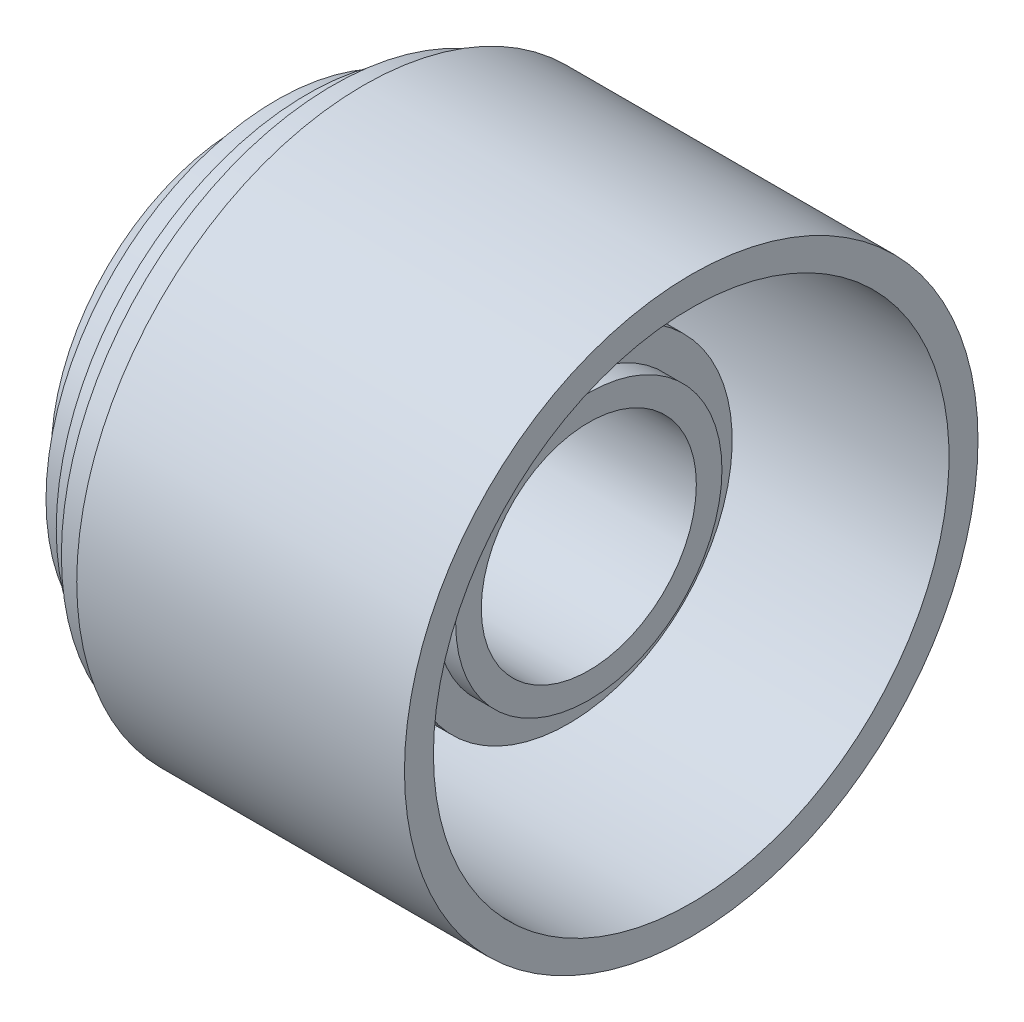
ISO-10303-21;
HEADER;
FILE_DESCRIPTION(('STEP AP214'),'2;1');
FILE_NAME('part.step','',(''),(''),'','','');
FILE_SCHEMA(('AUTOMOTIVE_DESIGN { 1 0 10303 214 1 1 1 1 }'));
ENDSEC;
DATA;
#1=APPLICATION_CONTEXT('core data for automotive mechanical design processes');
#2=APPLICATION_PROTOCOL_DEFINITION('international standard','automotive_design',2000,#1);
#3=PRODUCT_CONTEXT('',#1,'mechanical');
#4=PRODUCT('Part','Part','',(#3));
#5=PRODUCT_RELATED_PRODUCT_CATEGORY('part','',(#4));
#6=PRODUCT_DEFINITION_FORMATION('','',#4);
#7=PRODUCT_DEFINITION_CONTEXT('part definition',#1,'design');
#8=PRODUCT_DEFINITION('design','',#6,#7);
#9=PRODUCT_DEFINITION_SHAPE('','',#8);
#10=(LENGTH_UNIT() NAMED_UNIT(*) SI_UNIT(.MILLI.,.METRE.));
#11=(NAMED_UNIT(*) PLANE_ANGLE_UNIT() SI_UNIT($,.RADIAN.));
#12=(NAMED_UNIT(*) SI_UNIT($,.STERADIAN.) SOLID_ANGLE_UNIT());
#13=UNCERTAINTY_MEASURE_WITH_UNIT(LENGTH_MEASURE(1.E-05),#10,'distance_accuracy_value','');
#14=(GEOMETRIC_REPRESENTATION_CONTEXT(3) GLOBAL_UNCERTAINTY_ASSIGNED_CONTEXT((#13)) GLOBAL_UNIT_ASSIGNED_CONTEXT((#10,
#11,#12)) REPRESENTATION_CONTEXT('',''));
#15=CARTESIAN_POINT('',(0.,0.,0.));
#16=DIRECTION('',(0.,0.,1.));
#17=DIRECTION('',(1.,0.,0.));
#18=AXIS2_PLACEMENT_3D('',#15,#16,#17);
#19=CARTESIAN_POINT('',(-90.5,0.,0.));
#20=DIRECTION('',(-1.,0.,0.));
#21=DIRECTION('',(0.,0.,1.));
#22=AXIS2_PLACEMENT_3D('',#19,#20,#21);
#23=CYLINDRICAL_SURFACE('',#22,13.);
#24=CARTESIAN_POINT('',(0.,0.,0.));
#25=DIRECTION('',(-1.,0.,0.));
#26=DIRECTION('',(0.,0.,1.));
#27=AXIS2_PLACEMENT_3D('',#24,#25,#26);
#28=CIRCLE('',#27,13.);
#29=CARTESIAN_POINT('',(0.,0.,13.));
#30=VERTEX_POINT('',#29);
#31=EDGE_CURVE('E355',#30,#30,#28,.T.);
#32=ORIENTED_EDGE('',*,*,#31,.T.);
#33=EDGE_LOOP('',(#32));
#34=FACE_BOUND('',#33,.T.);
#35=CARTESIAN_POINT('',(-2.,0.,0.));
#36=DIRECTION('',(-1.,0.,0.));
#37=DIRECTION('',(0.,0.,1.));
#38=AXIS2_PLACEMENT_3D('',#35,#36,#37);
#39=CIRCLE('',#38,13.);
#40=CARTESIAN_POINT('',(-2.,0.,13.));
#41=VERTEX_POINT('',#40);
#42=EDGE_CURVE('E10',#41,#41,#39,.T.);
#43=ORIENTED_EDGE('',*,*,#42,.F.);
#44=EDGE_LOOP('',(#43));
#45=FACE_BOUND('',#44,.T.);
#46=ADVANCED_FACE('F348',(#34,#45),#23,.T.);
#47=CARTESIAN_POINT('',(0.,13.,0.));
#48=DIRECTION('',(-1.,0.,0.));
#49=DIRECTION('',(0.,0.,1.));
#50=AXIS2_PLACEMENT_3D('',#47,#48,#49);
#51=PLANE('',#50);
#52=ORIENTED_EDGE('',*,*,#31,.F.);
#53=EDGE_LOOP('',(#52));
#54=FACE_BOUND('',#53,.T.);
#55=CARTESIAN_POINT('',(0.,0.,0.));
#56=DIRECTION('',(-1.,0.,0.));
#57=DIRECTION('',(0.,0.,1.));
#58=AXIS2_PLACEMENT_3D('',#55,#56,#57);
#59=CIRCLE('',#58,10.5);
#60=CARTESIAN_POINT('',(0.,0.,10.5));
#61=VERTEX_POINT('',#60);
#62=EDGE_CURVE('E363',#61,#61,#59,.T.);
#63=ORIENTED_EDGE('',*,*,#62,.T.);
#64=EDGE_LOOP('',(#63));
#65=FACE_BOUND('',#64,.T.);
#66=ADVANCED_FACE('F350',(#54,#65),#51,.F.);
#67=CARTESIAN_POINT('',(-21.,0.,0.));
#68=DIRECTION('',(-1.,0.,0.));
#69=DIRECTION('',(0.,0.,1.));
#70=AXIS2_PLACEMENT_3D('',#67,#68,#69);
#71=CONICAL_SURFACE('',#70,13.,0.694738276196703);
#72=CARTESIAN_POINT('',(-18.,0.,0.));
#73=DIRECTION('',(-1.,0.,0.));
#74=DIRECTION('',(0.,0.,1.));
#75=AXIS2_PLACEMENT_3D('',#72,#73,#74);
#76=CIRCLE('',#75,10.5);
#77=CARTESIAN_POINT('',(-18.,0.,10.5));
#78=VERTEX_POINT('',#77);
#79=EDGE_CURVE('E359',#78,#78,#76,.T.);
#80=ORIENTED_EDGE('',*,*,#79,.F.);
#81=EDGE_LOOP('',(#80));
#82=FACE_BOUND('',#81,.T.);
#83=CARTESIAN_POINT('',(-21.,0.,0.));
#84=DIRECTION('',(-1.,0.,0.));
#85=DIRECTION('',(0.,0.,1.));
#86=AXIS2_PLACEMENT_3D('',#83,#84,#85);
#87=CIRCLE('',#86,13.);
#88=CARTESIAN_POINT('',(-21.,0.,13.));
#89=VERTEX_POINT('',#88);
#90=EDGE_CURVE('E368',#89,#89,#87,.F.);
#91=ORIENTED_EDGE('',*,*,#90,.F.);
#92=EDGE_LOOP('',(#91));
#93=FACE_BOUND('',#92,.T.);
#94=ADVANCED_FACE('F572',(#82,#93),#71,.F.);
#95=CARTESIAN_POINT('',(-90.5,0.,0.));
#96=DIRECTION('',(-1.,0.,0.));
#97=DIRECTION('',(0.,0.,1.));
#98=AXIS2_PLACEMENT_3D('',#95,#96,#97);
#99=CYLINDRICAL_SURFACE('',#98,10.5);
#100=ORIENTED_EDGE('',*,*,#62,.F.);
#101=EDGE_LOOP('',(#100));
#102=FACE_BOUND('',#101,.T.);
#103=ORIENTED_EDGE('',*,*,#79,.T.);
#104=EDGE_LOOP('',(#103));
#105=FACE_BOUND('',#104,.T.);
#106=ADVANCED_FACE('F565',(#102,#105),#99,.F.);
#107=CARTESIAN_POINT('',(-35.5,0.,0.));
#108=DIRECTION('',(-1.,0.,0.));
#109=DIRECTION('',(0.,0.,1.));
#110=AXIS2_PLACEMENT_3D('',#107,#108,#109);
#111=CYLINDRICAL_SURFACE('',#110,13.);
#112=CARTESIAN_POINT('',(-27.,0.,0.));
#113=DIRECTION('',(-1.,0.,0.));
#114=DIRECTION('',(0.,0.,1.));
#115=AXIS2_PLACEMENT_3D('',#112,#113,#114);
#116=CIRCLE('',#115,13.);
#117=CARTESIAN_POINT('',(-27.,0.,13.));
#118=VERTEX_POINT('',#117);
#119=EDGE_CURVE('E432',#118,#118,#116,.T.);
#120=ORIENTED_EDGE('',*,*,#119,.T.);
#121=EDGE_LOOP('',(#120));
#122=FACE_BOUND('',#121,.T.);
#123=ORIENTED_EDGE('',*,*,#90,.T.);
#124=EDGE_LOOP('',(#123));
#125=FACE_BOUND('',#124,.T.);
#126=ADVANCED_FACE('F436',(#122,#125),#111,.F.);
#127=CARTESIAN_POINT('',(-2.,13.,0.));
#128=DIRECTION('',(-1.,0.,0.));
#129=DIRECTION('',(0.,0.,1.));
#130=AXIS2_PLACEMENT_3D('',#127,#128,#129);
#131=PLANE('',#130);
#132=CARTESIAN_POINT('',(-2.,0.,0.));
#133=DIRECTION('',(-1.,0.,0.));
#134=DIRECTION('',(0.,0.,1.));
#135=AXIS2_PLACEMENT_3D('',#132,#133,#134);
#136=CIRCLE('',#135,16.);
#137=CARTESIAN_POINT('',(-2.,0.,16.));
#138=VERTEX_POINT('',#137);
#139=EDGE_CURVE('E371',#138,#138,#136,.T.);
#140=ORIENTED_EDGE('',*,*,#139,.F.);
#141=EDGE_LOOP('',(#140));
#142=FACE_BOUND('',#141,.T.);
#143=ORIENTED_EDGE('',*,*,#42,.T.);
#144=EDGE_LOOP('',(#143));
#145=FACE_BOUND('',#144,.T.);
#146=ADVANCED_FACE('F556',(#142,#145),#131,.F.);
#147=CARTESIAN_POINT('',(-35.5,0.,0.));
#148=DIRECTION('',(-1.,0.,0.));
#149=DIRECTION('',(0.,0.,1.));
#150=AXIS2_PLACEMENT_3D('',#147,#148,#149);
#151=CYLINDRICAL_SURFACE('',#150,16.);
#152=CARTESIAN_POINT('',(-22.,0.,0.));
#153=DIRECTION('',(-1.,0.,0.));
#154=DIRECTION('',(0.,0.,1.));
#155=AXIS2_PLACEMENT_3D('',#152,#153,#154);
#156=CIRCLE('',#155,16.);
#157=CARTESIAN_POINT('',(-22.,0.,16.));
#158=VERTEX_POINT('',#157);
#159=EDGE_CURVE('E374',#158,#158,#156,.T.);
#160=ORIENTED_EDGE('',*,*,#159,.F.);
#161=EDGE_LOOP('',(#160));
#162=FACE_BOUND('',#161,.T.);
#163=ORIENTED_EDGE('',*,*,#139,.T.);
#164=EDGE_LOOP('',(#163));
#165=FACE_BOUND('',#164,.T.);
#166=ADVANCED_FACE('F550',(#162,#165),#151,.T.);
#167=CARTESIAN_POINT('',(-22.,0.,0.));
#168=DIRECTION('',(-1.,0.,0.));
#169=DIRECTION('',(0.,0.,1.));
#170=AXIS2_PLACEMENT_3D('',#167,#168,#169);
#171=TOROIDAL_SURFACE('',#170,19.1875,3.1875);
#172=CARTESIAN_POINT('',(-23.7681068754679,0.,0.));
#173=DIRECTION('',(-1.,0.,0.));
#174=DIRECTION('',(0.,0.,1.));
#175=AXIS2_PLACEMENT_3D('',#172,#173,#174);
#176=CIRCLE('',#175,21.8396603132019);
#177=CARTESIAN_POINT('',(-23.7681068754679,0.,21.8396603132019));
#178=VERTEX_POINT('',#177);
#179=EDGE_CURVE('E378',#178,#178,#176,.T.);
#180=ORIENTED_EDGE('',*,*,#179,.F.);
#181=EDGE_LOOP('',(#180));
#182=FACE_BOUND('',#181,.T.);
#183=ORIENTED_EDGE('',*,*,#159,.T.);
#184=EDGE_LOOP('',(#183));
#185=FACE_BOUND('',#184,.T.);
#186=ADVANCED_FACE('F544',(#182,#185),#171,.F.);
#187=CARTESIAN_POINT('',(-23.7681068754679,0.,0.));
#188=DIRECTION('',(1.,0.,0.));
#189=DIRECTION('',(0.,0.,-1.));
#190=AXIS2_PLACEMENT_3D('',#187,#188,#189);
#191=CONICAL_SURFACE('',#190,21.8396603132019,0.588002603547568);
#192=CARTESIAN_POINT('',(-20.0277370757849,0.,0.));
#193=DIRECTION('',(-1.,0.,0.));
#194=DIRECTION('',(0.,0.,1.));
#195=AXIS2_PLACEMENT_3D('',#192,#193,#194);
#196=CIRCLE('',#195,24.3332401796572);
#197=CARTESIAN_POINT('',(-20.0277370757849,0.,24.3332401796572));
#198=VERTEX_POINT('',#197);
#199=EDGE_CURVE('E381',#198,#198,#196,.T.);
#200=ORIENTED_EDGE('',*,*,#199,.F.);
#201=EDGE_LOOP('',(#200));
#202=FACE_BOUND('',#201,.T.);
#203=ORIENTED_EDGE('',*,*,#179,.T.);
#204=EDGE_LOOP('',(#203));
#205=FACE_BOUND('',#204,.T.);
#206=ADVANCED_FACE('F538',(#202,#205),#191,.F.);
#207=CARTESIAN_POINT('',(-17.2542360946587,0.,0.));
#208=DIRECTION('',(-1.,0.,0.));
#209=DIRECTION('',(0.,0.,1.));
#210=AXIS2_PLACEMENT_3D('',#207,#208,#209);
#211=TOROIDAL_SURFACE('',#210,20.172988707968,5.);
#212=CARTESIAN_POINT('',(-17.2542360946587,0.,0.));
#213=DIRECTION('',(-1.,0.,0.));
#214=DIRECTION('',(0.,0.,1.));
#215=AXIS2_PLACEMENT_3D('',#212,#213,#214);
#216=CIRCLE('',#215,25.172988707968);
#217=CARTESIAN_POINT('',(-17.2542360946587,0.,25.172988707968));
#218=VERTEX_POINT('',#217);
#219=EDGE_CURVE('E384',#218,#218,#216,.T.);
#220=ORIENTED_EDGE('',*,*,#219,.F.);
#221=EDGE_LOOP('',(#220));
#222=FACE_BOUND('',#221,.T.);
#223=ORIENTED_EDGE('',*,*,#199,.T.);
#224=EDGE_LOOP('',(#223));
#225=FACE_BOUND('',#224,.T.);
#226=ADVANCED_FACE('F532',(#222,#225),#211,.F.);
#227=CARTESIAN_POINT('',(-35.5,0.,0.));
#228=DIRECTION('',(-1.,0.,0.));
#229=DIRECTION('',(0.,0.,1.));
#230=AXIS2_PLACEMENT_3D('',#227,#228,#229);
#231=CYLINDRICAL_SURFACE('',#230,25.172988707968);
#232=CARTESIAN_POINT('',(9.99999999999999,0.,0.));
#233=DIRECTION('',(-1.,0.,0.));
#234=DIRECTION('',(0.,0.,1.));
#235=AXIS2_PLACEMENT_3D('',#232,#233,#234);
#236=CIRCLE('',#235,25.172988707968);
#237=CARTESIAN_POINT('',(9.99999999999999,0.,25.172988707968));
#238=VERTEX_POINT('',#237);
#239=EDGE_CURVE('E387',#238,#238,#236,.T.);
#240=ORIENTED_EDGE('',*,*,#239,.F.);
#241=EDGE_LOOP('',(#240));
#242=FACE_BOUND('',#241,.T.);
#243=ORIENTED_EDGE('',*,*,#219,.T.);
#244=EDGE_LOOP('',(#243));
#245=FACE_BOUND('',#244,.T.);
#246=ADVANCED_FACE('F526',(#242,#245),#231,.F.);
#247=CARTESIAN_POINT('',(9.99999999999999,25.172988707968,0.));
#248=DIRECTION('',(-1.,0.,0.));
#249=DIRECTION('',(0.,0.,1.));
#250=AXIS2_PLACEMENT_3D('',#247,#248,#249);
#251=PLANE('',#250);
#252=CARTESIAN_POINT('',(9.99999999999999,0.,0.));
#253=DIRECTION('',(-1.,0.,0.));
#254=DIRECTION('',(0.,0.,1.));
#255=AXIS2_PLACEMENT_3D('',#252,#253,#254);
#256=CIRCLE('',#255,28.);
#257=CARTESIAN_POINT('',(9.99999999999999,0.,28.));
#258=VERTEX_POINT('',#257);
#259=EDGE_CURVE('E390',#258,#258,#256,.T.);
#260=ORIENTED_EDGE('',*,*,#259,.F.);
#261=EDGE_LOOP('',(#260));
#262=FACE_BOUND('',#261,.T.);
#263=ORIENTED_EDGE('',*,*,#239,.T.);
#264=EDGE_LOOP('',(#263));
#265=FACE_BOUND('',#264,.T.);
#266=ADVANCED_FACE('F520',(#262,#265),#251,.F.);
#267=CARTESIAN_POINT('',(-35.5,0.,0.));
#268=DIRECTION('',(-1.,0.,0.));
#269=DIRECTION('',(0.,0.,1.));
#270=AXIS2_PLACEMENT_3D('',#267,#268,#269);
#271=CYLINDRICAL_SURFACE('',#270,28.);
#272=CARTESIAN_POINT('',(-22.,0.,0.));
#273=DIRECTION('',(-1.,0.,0.));
#274=DIRECTION('',(0.,0.,1.));
#275=AXIS2_PLACEMENT_3D('',#272,#273,#274);
#276=CIRCLE('',#275,28.);
#277=CARTESIAN_POINT('',(-22.,0.,28.));
#278=VERTEX_POINT('',#277);
#279=EDGE_CURVE('E393',#278,#278,#276,.T.);
#280=ORIENTED_EDGE('',*,*,#279,.F.);
#281=EDGE_LOOP('',(#280));
#282=FACE_BOUND('',#281,.T.);
#283=ORIENTED_EDGE('',*,*,#259,.T.);
#284=EDGE_LOOP('',(#283));
#285=FACE_BOUND('',#284,.T.);
#286=ADVANCED_FACE('F514',(#282,#285),#271,.T.);
#287=CARTESIAN_POINT('',(-22.,28.,0.));
#288=DIRECTION('',(1.,0.,0.));
#289=DIRECTION('',(0.,0.,-1.));
#290=AXIS2_PLACEMENT_3D('',#287,#288,#289);
#291=PLANE('',#290);
#292=CARTESIAN_POINT('',(-22.,0.,0.));
#293=DIRECTION('',(-1.,0.,0.));
#294=DIRECTION('',(0.,0.,1.));
#295=AXIS2_PLACEMENT_3D('',#292,#293,#294);
#296=CIRCLE('',#295,26.5000000000001);
#297=CARTESIAN_POINT('',(-22.,0.,26.5000000000001));
#298=VERTEX_POINT('',#297);
#299=EDGE_CURVE('E396',#298,#298,#296,.T.);
#300=ORIENTED_EDGE('',*,*,#299,.F.);
#301=EDGE_LOOP('',(#300));
#302=FACE_BOUND('',#301,.T.);
#303=ORIENTED_EDGE('',*,*,#279,.T.);
#304=EDGE_LOOP('',(#303));
#305=FACE_BOUND('',#304,.T.);
#306=ADVANCED_FACE('F508',(#302,#305),#291,.F.);
#307=CARTESIAN_POINT('',(-35.5,0.,0.));
#308=DIRECTION('',(-1.,0.,0.));
#309=DIRECTION('',(0.,0.,1.));
#310=AXIS2_PLACEMENT_3D('',#307,#308,#309);
#311=CYLINDRICAL_SURFACE('',#310,26.5000000000001);
#312=CARTESIAN_POINT('',(-25.,0.,0.));
#313=DIRECTION('',(-1.,0.,0.));
#314=DIRECTION('',(0.,0.,1.));
#315=AXIS2_PLACEMENT_3D('',#312,#313,#314);
#316=CIRCLE('',#315,26.5000000000001);
#317=CARTESIAN_POINT('',(-25.,0.,26.5000000000001));
#318=VERTEX_POINT('',#317);
#319=EDGE_CURVE('E399',#318,#318,#316,.T.);
#320=ORIENTED_EDGE('',*,*,#319,.F.);
#321=EDGE_LOOP('',(#320));
#322=FACE_BOUND('',#321,.T.);
#323=ORIENTED_EDGE('',*,*,#299,.T.);
#324=EDGE_LOOP('',(#323));
#325=FACE_BOUND('',#324,.T.);
#326=ADVANCED_FACE('F502',(#322,#325),#311,.T.);
#327=CARTESIAN_POINT('',(-25.,26.5000000000001,0.));
#328=DIRECTION('',(1.,0.,0.));
#329=DIRECTION('',(0.,0.,-1.));
#330=AXIS2_PLACEMENT_3D('',#327,#328,#329);
#331=PLANE('',#330);
#332=CARTESIAN_POINT('',(-25.,0.,0.));
#333=DIRECTION('',(-1.,0.,0.));
#334=DIRECTION('',(0.,0.,1.));
#335=AXIS2_PLACEMENT_3D('',#332,#333,#334);
#336=CIRCLE('',#335,24.5000000000001);
#337=CARTESIAN_POINT('',(-25.,0.,24.5000000000001));
#338=VERTEX_POINT('',#337);
#339=EDGE_CURVE('E402',#338,#338,#336,.T.);
#340=ORIENTED_EDGE('',*,*,#339,.F.);
#341=EDGE_LOOP('',(#340));
#342=FACE_BOUND('',#341,.T.);
#343=ORIENTED_EDGE('',*,*,#319,.T.);
#344=EDGE_LOOP('',(#343));
#345=FACE_BOUND('',#344,.T.);
#346=ADVANCED_FACE('F496',(#342,#345),#331,.F.);
#347=CARTESIAN_POINT('',(-35.5,0.,0.));
#348=DIRECTION('',(-1.,0.,0.));
#349=DIRECTION('',(0.,0.,1.));
#350=AXIS2_PLACEMENT_3D('',#347,#348,#349);
#351=CYLINDRICAL_SURFACE('',#350,24.5000000000001);
#352=CARTESIAN_POINT('',(-27.5,0.,0.));
#353=DIRECTION('',(-1.,0.,0.));
#354=DIRECTION('',(0.,0.,1.));
#355=AXIS2_PLACEMENT_3D('',#352,#353,#354);
#356=CIRCLE('',#355,24.5000000000001);
#357=CARTESIAN_POINT('',(-27.5,0.,24.5000000000001));
#358=VERTEX_POINT('',#357);
#359=EDGE_CURVE('E405',#358,#358,#356,.T.);
#360=ORIENTED_EDGE('',*,*,#359,.F.);
#361=EDGE_LOOP('',(#360));
#362=FACE_BOUND('',#361,.T.);
#363=ORIENTED_EDGE('',*,*,#339,.T.);
#364=EDGE_LOOP('',(#363));
#365=FACE_BOUND('',#364,.T.);
#366=ADVANCED_FACE('F490',(#362,#365),#351,.T.);
#367=CARTESIAN_POINT('',(-27.5,24.5000000000001,0.));
#368=DIRECTION('',(1.,0.,0.));
#369=DIRECTION('',(0.,0.,-1.));
#370=AXIS2_PLACEMENT_3D('',#367,#368,#369);
#371=PLANE('',#370);
#372=CARTESIAN_POINT('',(-27.5,0.,0.));
#373=DIRECTION('',(-1.,0.,0.));
#374=DIRECTION('',(0.,0.,1.));
#375=AXIS2_PLACEMENT_3D('',#372,#373,#374);
#376=CIRCLE('',#375,22.5000000000001);
#377=CARTESIAN_POINT('',(-27.5,0.,22.5000000000001));
#378=VERTEX_POINT('',#377);
#379=EDGE_CURVE('E408',#378,#378,#376,.T.);
#380=ORIENTED_EDGE('',*,*,#379,.F.);
#381=EDGE_LOOP('',(#380));
#382=FACE_BOUND('',#381,.T.);
#383=ORIENTED_EDGE('',*,*,#359,.T.);
#384=EDGE_LOOP('',(#383));
#385=FACE_BOUND('',#384,.T.);
#386=ADVANCED_FACE('F484',(#382,#385),#371,.F.);
#387=CARTESIAN_POINT('',(-35.5,0.,0.));
#388=DIRECTION('',(-1.,0.,0.));
#389=DIRECTION('',(0.,0.,1.));
#390=AXIS2_PLACEMENT_3D('',#387,#388,#389);
#391=CYLINDRICAL_SURFACE('',#390,22.5000000000001);
#392=CARTESIAN_POINT('',(-30.5,0.,0.));
#393=DIRECTION('',(-1.,0.,0.));
#394=DIRECTION('',(0.,0.,1.));
#395=AXIS2_PLACEMENT_3D('',#392,#393,#394);
#396=CIRCLE('',#395,22.5000000000001);
#397=CARTESIAN_POINT('',(-30.5,0.,22.5000000000001));
#398=VERTEX_POINT('',#397);
#399=EDGE_CURVE('E411',#398,#398,#396,.T.);
#400=ORIENTED_EDGE('',*,*,#399,.F.);
#401=EDGE_LOOP('',(#400));
#402=FACE_BOUND('',#401,.T.);
#403=ORIENTED_EDGE('',*,*,#379,.T.);
#404=EDGE_LOOP('',(#403));
#405=FACE_BOUND('',#404,.T.);
#406=ADVANCED_FACE('F478',(#402,#405),#391,.T.);
#407=CARTESIAN_POINT('',(-30.5,22.5000000000001,0.));
#408=DIRECTION('',(1.,0.,0.));
#409=DIRECTION('',(0.,0.,-1.));
#410=AXIS2_PLACEMENT_3D('',#407,#408,#409);
#411=PLANE('',#410);
#412=CARTESIAN_POINT('',(-30.5,0.,0.));
#413=DIRECTION('',(-1.,0.,0.));
#414=DIRECTION('',(0.,0.,1.));
#415=AXIS2_PLACEMENT_3D('',#412,#413,#414);
#416=CIRCLE('',#415,20.672988707968);
#417=CARTESIAN_POINT('',(-30.5,0.,20.672988707968));
#418=VERTEX_POINT('',#417);
#419=EDGE_CURVE('E414',#418,#418,#416,.T.);
#420=ORIENTED_EDGE('',*,*,#419,.F.);
#421=EDGE_LOOP('',(#420));
#422=FACE_BOUND('',#421,.T.);
#423=ORIENTED_EDGE('',*,*,#399,.T.);
#424=EDGE_LOOP('',(#423));
#425=FACE_BOUND('',#424,.T.);
#426=ADVANCED_FACE('F472',(#422,#425),#411,.F.);
#427=CARTESIAN_POINT('',(-30.5,0.,0.));
#428=DIRECTION('',(1.,0.,0.));
#429=DIRECTION('',(0.,0.,-1.));
#430=AXIS2_PLACEMENT_3D('',#427,#428,#429);
#431=CONICAL_SURFACE('',#430,20.672988707968,0.555612304932108);
#432=CARTESIAN_POINT('',(-34.,0.,0.));
#433=DIRECTION('',(-1.,0.,0.));
#434=DIRECTION('',(0.,0.,1.));
#435=AXIS2_PLACEMENT_3D('',#432,#433,#434);
#436=CIRCLE('',#435,18.5);
#437=CARTESIAN_POINT('',(-34.,0.,18.5));
#438=VERTEX_POINT('',#437);
#439=EDGE_CURVE('E417',#438,#438,#436,.T.);
#440=ORIENTED_EDGE('',*,*,#439,.F.);
#441=EDGE_LOOP('',(#440));
#442=FACE_BOUND('',#441,.T.);
#443=ORIENTED_EDGE('',*,*,#419,.T.);
#444=EDGE_LOOP('',(#443));
#445=FACE_BOUND('',#444,.T.);
#446=ADVANCED_FACE('F466',(#442,#445),#431,.T.);
#447=CARTESIAN_POINT('',(-34.,16.,0.));
#448=DIRECTION('',(1.,0.,0.));
#449=DIRECTION('',(0.,0.,-1.));
#450=AXIS2_PLACEMENT_3D('',#447,#448,#449);
#451=PLANE('',#450);
#452=CARTESIAN_POINT('',(-34.,0.,0.));
#453=DIRECTION('',(-1.,0.,0.));
#454=DIRECTION('',(0.,0.,1.));
#455=AXIS2_PLACEMENT_3D('',#452,#453,#454);
#456=CIRCLE('',#455,16.);
#457=CARTESIAN_POINT('',(-34.,0.,16.));
#458=VERTEX_POINT('',#457);
#459=EDGE_CURVE('E420',#458,#458,#456,.T.);
#460=ORIENTED_EDGE('',*,*,#459,.F.);
#461=EDGE_LOOP('',(#460));
#462=FACE_BOUND('',#461,.T.);
#463=ORIENTED_EDGE('',*,*,#439,.T.);
#464=EDGE_LOOP('',(#463));
#465=FACE_BOUND('',#464,.T.);
#466=ADVANCED_FACE('F460',(#462,#465),#451,.F.);
#467=CARTESIAN_POINT('',(-35.5,0.,0.));
#468=DIRECTION('',(-1.,0.,0.));
#469=DIRECTION('',(0.,0.,1.));
#470=AXIS2_PLACEMENT_3D('',#467,#468,#469);
#471=CYLINDRICAL_SURFACE('',#470,16.);
#472=CARTESIAN_POINT('',(-29.,0.,0.));
#473=DIRECTION('',(-1.,0.,0.));
#474=DIRECTION('',(0.,0.,1.));
#475=AXIS2_PLACEMENT_3D('',#472,#473,#474);
#476=CIRCLE('',#475,16.);
#477=CARTESIAN_POINT('',(-29.,0.,16.));
#478=VERTEX_POINT('',#477);
#479=EDGE_CURVE('E423',#478,#478,#476,.T.);
#480=ORIENTED_EDGE('',*,*,#479,.F.);
#481=EDGE_LOOP('',(#480));
#482=FACE_BOUND('',#481,.T.);
#483=ORIENTED_EDGE('',*,*,#459,.T.);
#484=EDGE_LOOP('',(#483));
#485=FACE_BOUND('',#484,.T.);
#486=ADVANCED_FACE('F454',(#482,#485),#471,.F.);
#487=CARTESIAN_POINT('',(-29.,14.5,0.));
#488=DIRECTION('',(1.,0.,0.));
#489=DIRECTION('',(0.,0.,-1.));
#490=AXIS2_PLACEMENT_3D('',#487,#488,#489);
#491=PLANE('',#490);
#492=CARTESIAN_POINT('',(-29.,0.,0.));
#493=DIRECTION('',(-1.,0.,0.));
#494=DIRECTION('',(0.,0.,1.));
#495=AXIS2_PLACEMENT_3D('',#492,#493,#494);
#496=CIRCLE('',#495,14.5);
#497=CARTESIAN_POINT('',(-29.,0.,14.5));
#498=VERTEX_POINT('',#497);
#499=EDGE_CURVE('E426',#498,#498,#496,.T.);
#500=ORIENTED_EDGE('',*,*,#499,.F.);
#501=EDGE_LOOP('',(#500));
#502=FACE_BOUND('',#501,.T.);
#503=ORIENTED_EDGE('',*,*,#479,.T.);
#504=EDGE_LOOP('',(#503));
#505=FACE_BOUND('',#504,.T.);
#506=ADVANCED_FACE('F448',(#502,#505),#491,.F.);
#507=CARTESIAN_POINT('',(-35.5,0.,0.));
#508=DIRECTION('',(-1.,0.,0.));
#509=DIRECTION('',(0.,0.,1.));
#510=AXIS2_PLACEMENT_3D('',#507,#508,#509);
#511=CYLINDRICAL_SURFACE('',#510,14.5);
#512=CARTESIAN_POINT('',(-27.,0.,0.));
#513=DIRECTION('',(-1.,0.,0.));
#514=DIRECTION('',(0.,0.,1.));
#515=AXIS2_PLACEMENT_3D('',#512,#513,#514);
#516=CIRCLE('',#515,14.5);
#517=CARTESIAN_POINT('',(-27.,0.,14.5));
#518=VERTEX_POINT('',#517);
#519=EDGE_CURVE('E429',#518,#518,#516,.T.);
#520=ORIENTED_EDGE('',*,*,#519,.F.);
#521=EDGE_LOOP('',(#520));
#522=FACE_BOUND('',#521,.T.);
#523=ORIENTED_EDGE('',*,*,#499,.T.);
#524=EDGE_LOOP('',(#523));
#525=FACE_BOUND('',#524,.T.);
#526=ADVANCED_FACE('F442',(#522,#525),#511,.F.);
#527=CARTESIAN_POINT('',(-27.,13.,0.));
#528=DIRECTION('',(1.,0.,0.));
#529=DIRECTION('',(0.,0.,-1.));
#530=AXIS2_PLACEMENT_3D('',#527,#528,#529);
#531=PLANE('',#530);
#532=ORIENTED_EDGE('',*,*,#119,.F.);
#533=EDGE_LOOP('',(#532));
#534=FACE_BOUND('',#533,.T.);
#535=ORIENTED_EDGE('',*,*,#519,.T.);
#536=EDGE_LOOP('',(#535));
#537=FACE_BOUND('',#536,.T.);
#538=ADVANCED_FACE('F439',(#534,#537),#531,.F.);
#539=CLOSED_SHELL('',(#46,#66,#94,#106,#126,#146,#166,#186,#206,#226,#246,#266,#286,#306,#326,
#346,#366,#386,#406,#426,#446,#466,#486,#506,#526,#538));
#540=MANIFOLD_SOLID_BREP('B2',#539);
#541=ADVANCED_BREP_SHAPE_REPRESENTATION('',(#18,#540),#14);
#542=SHAPE_DEFINITION_REPRESENTATION(#9,#541);
ENDSEC;
END-ISO-10303-21;
